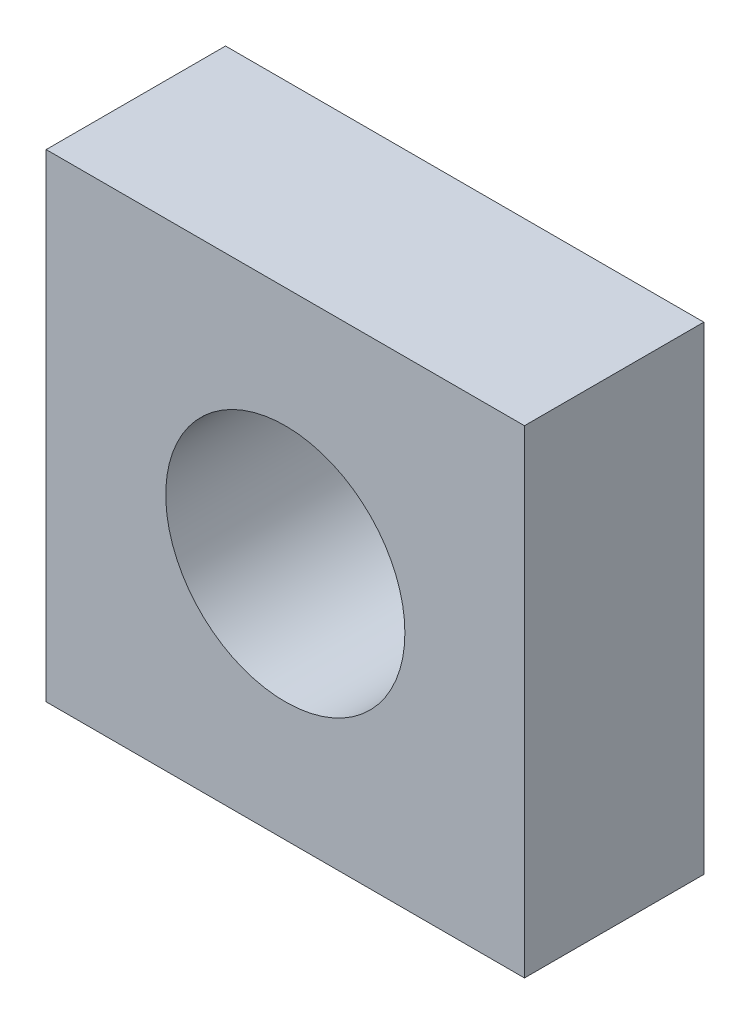
ISO-10303-21;
HEADER;
FILE_DESCRIPTION(('STEP AP214'),'2;1');
FILE_NAME('part.step','',(''),(''),'','','');
FILE_SCHEMA(('AUTOMOTIVE_DESIGN { 1 0 10303 214 1 1 1 1 }'));
ENDSEC;
DATA;
#1=APPLICATION_CONTEXT('core data for automotive mechanical design processes');
#2=APPLICATION_PROTOCOL_DEFINITION('international standard','automotive_design',2000,#1);
#3=PRODUCT_CONTEXT('',#1,'mechanical');
#4=PRODUCT('Part','Part','',(#3));
#5=PRODUCT_RELATED_PRODUCT_CATEGORY('part','',(#4));
#6=PRODUCT_DEFINITION_FORMATION('','',#4);
#7=PRODUCT_DEFINITION_CONTEXT('part definition',#1,'design');
#8=PRODUCT_DEFINITION('design','',#6,#7);
#9=PRODUCT_DEFINITION_SHAPE('','',#8);
#10=(LENGTH_UNIT() NAMED_UNIT(*) SI_UNIT(.MILLI.,.METRE.));
#11=(NAMED_UNIT(*) PLANE_ANGLE_UNIT() SI_UNIT($,.RADIAN.));
#12=(NAMED_UNIT(*) SI_UNIT($,.STERADIAN.) SOLID_ANGLE_UNIT());
#13=UNCERTAINTY_MEASURE_WITH_UNIT(LENGTH_MEASURE(1.E-05),#10,'distance_accuracy_value','');
#14=(GEOMETRIC_REPRESENTATION_CONTEXT(3) GLOBAL_UNCERTAINTY_ASSIGNED_CONTEXT((#13)) GLOBAL_UNIT_ASSIGNED_CONTEXT((#10,
#11,#12)) REPRESENTATION_CONTEXT('',''));
#15=CARTESIAN_POINT('',(0.,0.,0.));
#16=DIRECTION('',(0.,0.,1.));
#17=DIRECTION('',(1.,0.,0.));
#18=AXIS2_PLACEMENT_3D('',#15,#16,#17);
#19=CARTESIAN_POINT('',(0.,0.,30.));
#20=DIRECTION('',(0.,0.,-1.));
#21=DIRECTION('',(-1.,0.,0.));
#22=AXIS2_PLACEMENT_3D('',#19,#20,#21);
#23=PLANE('',#22);
#24=DIRECTION('',(-1.,0.,0.));
#25=VECTOR('',#24,1.);
#26=CARTESIAN_POINT('',(570.,580.,30.));
#27=LINE('',#26,#25);
#28=CARTESIAN_POINT('',(650.,580.,30.));
#29=VERTEX_POINT('',#28);
#30=CARTESIAN_POINT('',(570.,580.,30.));
#31=VERTEX_POINT('',#30);
#32=EDGE_CURVE('E85',#29,#31,#27,.T.);
#33=ORIENTED_EDGE('',*,*,#32,.T.);
#34=DIRECTION('',(0.,-1.,0.));
#35=VECTOR('',#34,1.);
#36=CARTESIAN_POINT('',(570.,580.,30.));
#37=LINE('',#36,#35);
#38=CARTESIAN_POINT('',(570.,500.,30.));
#39=VERTEX_POINT('',#38);
#40=EDGE_CURVE('E80',#31,#39,#37,.T.);
#41=ORIENTED_EDGE('',*,*,#40,.T.);
#42=DIRECTION('',(1.,0.,0.));
#43=VECTOR('',#42,1.);
#44=CARTESIAN_POINT('',(650.,500.,30.));
#45=LINE('',#44,#43);
#46=CARTESIAN_POINT('',(650.,500.,30.));
#47=VERTEX_POINT('',#46);
#48=EDGE_CURVE('E83',#39,#47,#45,.T.);
#49=ORIENTED_EDGE('',*,*,#48,.T.);
#50=DIRECTION('',(0.,1.,0.));
#51=VECTOR('',#50,1.);
#52=CARTESIAN_POINT('',(650.,580.,30.));
#53=LINE('',#52,#51);
#54=EDGE_CURVE('E50',#47,#29,#53,.T.);
#55=ORIENTED_EDGE('',*,*,#54,.T.);
#56=EDGE_LOOP('',(#33,#41,#49,#55));
#57=FACE_BOUND('',#56,.T.);
#58=CARTESIAN_POINT('',(610.,540.,30.));
#59=DIRECTION('',(0.,0.,1.));
#60=DIRECTION('',(1.,0.,0.));
#61=AXIS2_PLACEMENT_3D('',#58,#59,#60);
#62=CIRCLE('',#61,20.);
#63=CARTESIAN_POINT('',(630.,540.,30.));
#64=VERTEX_POINT('',#63);
#65=EDGE_CURVE('E100',#64,#64,#62,.T.);
#66=ORIENTED_EDGE('',*,*,#65,.F.);
#67=EDGE_LOOP('',(#66));
#68=FACE_BOUND('',#67,.T.);
#69=ADVANCED_FACE('F33',(#57,#68),#23,.F.);
#70=CARTESIAN_POINT('',(0.,0.,0.));
#71=DIRECTION('',(0.,0.,-1.));
#72=DIRECTION('',(-1.,0.,0.));
#73=AXIS2_PLACEMENT_3D('',#70,#71,#72);
#74=PLANE('',#73);
#75=DIRECTION('',(-1.,0.,0.));
#76=VECTOR('',#75,1.);
#77=CARTESIAN_POINT('',(570.,580.,0.));
#78=LINE('',#77,#76);
#79=CARTESIAN_POINT('',(650.,580.,0.));
#80=VERTEX_POINT('',#79);
#81=CARTESIAN_POINT('',(570.,580.,0.));
#82=VERTEX_POINT('',#81);
#83=EDGE_CURVE('E97',#80,#82,#78,.T.);
#84=ORIENTED_EDGE('',*,*,#83,.F.);
#85=DIRECTION('',(0.,1.,0.));
#86=VECTOR('',#85,1.);
#87=CARTESIAN_POINT('',(650.,580.,0.));
#88=LINE('',#87,#86);
#89=CARTESIAN_POINT('',(650.,500.,0.));
#90=VERTEX_POINT('',#89);
#91=EDGE_CURVE('E73',#90,#80,#88,.T.);
#92=ORIENTED_EDGE('',*,*,#91,.F.);
#93=DIRECTION('',(1.,0.,0.));
#94=VECTOR('',#93,1.);
#95=CARTESIAN_POINT('',(650.,500.,0.));
#96=LINE('',#95,#94);
#97=CARTESIAN_POINT('',(570.,500.,0.));
#98=VERTEX_POINT('',#97);
#99=EDGE_CURVE('E67',#98,#90,#96,.T.);
#100=ORIENTED_EDGE('',*,*,#99,.F.);
#101=DIRECTION('',(0.,-1.,0.));
#102=VECTOR('',#101,1.);
#103=CARTESIAN_POINT('',(570.,580.,0.));
#104=LINE('',#103,#102);
#105=EDGE_CURVE('E89',#82,#98,#104,.T.);
#106=ORIENTED_EDGE('',*,*,#105,.F.);
#107=EDGE_LOOP('',(#84,#92,#100,#106));
#108=FACE_BOUND('',#107,.T.);
#109=CARTESIAN_POINT('',(610.,540.,0.));
#110=DIRECTION('',(0.,0.,1.));
#111=DIRECTION('',(1.,0.,0.));
#112=AXIS2_PLACEMENT_3D('',#109,#110,#111);
#113=CIRCLE('',#112,20.);
#114=CARTESIAN_POINT('',(630.,540.,0.));
#115=VERTEX_POINT('',#114);
#116=EDGE_CURVE('E112',#115,#115,#113,.T.);
#117=ORIENTED_EDGE('',*,*,#116,.T.);
#118=EDGE_LOOP('',(#117));
#119=FACE_BOUND('',#118,.T.);
#120=ADVANCED_FACE('F108',(#108,#119),#74,.T.);
#121=CARTESIAN_POINT('',(570.,580.,30.));
#122=DIRECTION('',(0.,-1.,0.));
#123=DIRECTION('',(0.,0.,-1.));
#124=AXIS2_PLACEMENT_3D('',#121,#122,#123);
#125=PLANE('',#124);
#126=ORIENTED_EDGE('',*,*,#83,.T.);
#127=DIRECTION('',(0.,0.,-1.));
#128=VECTOR('',#127,1.);
#129=CARTESIAN_POINT('',(570.,580.,30.));
#130=LINE('',#129,#128);
#131=EDGE_CURVE('E11',#31,#82,#130,.T.);
#132=ORIENTED_EDGE('',*,*,#131,.F.);
#133=ORIENTED_EDGE('',*,*,#32,.F.);
#134=DIRECTION('',(0.,0.,-1.));
#135=VECTOR('',#134,1.);
#136=CARTESIAN_POINT('',(650.,580.,30.));
#137=LINE('',#136,#135);
#138=EDGE_CURVE('E93',#29,#80,#137,.T.);
#139=ORIENTED_EDGE('',*,*,#138,.T.);
#140=EDGE_LOOP('',(#126,#132,#133,#139));
#141=FACE_BOUND('',#140,.T.);
#142=ADVANCED_FACE('F35',(#141),#125,.F.);
#143=CARTESIAN_POINT('',(570.,580.,30.));
#144=DIRECTION('',(1.,0.,0.));
#145=DIRECTION('',(0.,0.,-1.));
#146=AXIS2_PLACEMENT_3D('',#143,#144,#145);
#147=PLANE('',#146);
#148=ORIENTED_EDGE('',*,*,#105,.T.);
#149=DIRECTION('',(0.,0.,-1.));
#150=VECTOR('',#149,1.);
#151=CARTESIAN_POINT('',(570.,500.,30.));
#152=LINE('',#151,#150);
#153=EDGE_CURVE('E42',#39,#98,#152,.T.);
#154=ORIENTED_EDGE('',*,*,#153,.F.);
#155=ORIENTED_EDGE('',*,*,#40,.F.);
#156=ORIENTED_EDGE('',*,*,#131,.T.);
#157=EDGE_LOOP('',(#148,#154,#155,#156));
#158=FACE_BOUND('',#157,.T.);
#159=ADVANCED_FACE('F88',(#158),#147,.F.);
#160=CARTESIAN_POINT('',(650.,500.,30.));
#161=DIRECTION('',(0.,1.,0.));
#162=DIRECTION('',(0.,0.,1.));
#163=AXIS2_PLACEMENT_3D('',#160,#161,#162);
#164=PLANE('',#163);
#165=ORIENTED_EDGE('',*,*,#99,.T.);
#166=DIRECTION('',(0.,0.,-1.));
#167=VECTOR('',#166,1.);
#168=CARTESIAN_POINT('',(650.,500.,30.));
#169=LINE('',#168,#167);
#170=EDGE_CURVE('E90',#47,#90,#169,.T.);
#171=ORIENTED_EDGE('',*,*,#170,.F.);
#172=ORIENTED_EDGE('',*,*,#48,.F.);
#173=ORIENTED_EDGE('',*,*,#153,.T.);
#174=EDGE_LOOP('',(#165,#171,#172,#173));
#175=FACE_BOUND('',#174,.T.);
#176=ADVANCED_FACE('F91',(#175),#164,.F.);
#177=CARTESIAN_POINT('',(650.,580.,30.));
#178=DIRECTION('',(-1.,0.,0.));
#179=DIRECTION('',(0.,-1.,0.));
#180=AXIS2_PLACEMENT_3D('',#177,#178,#179);
#181=PLANE('',#180);
#182=ORIENTED_EDGE('',*,*,#91,.T.);
#183=ORIENTED_EDGE('',*,*,#138,.F.);
#184=ORIENTED_EDGE('',*,*,#54,.F.);
#185=ORIENTED_EDGE('',*,*,#170,.T.);
#186=EDGE_LOOP('',(#182,#183,#184,#185));
#187=FACE_BOUND('',#186,.T.);
#188=ADVANCED_FACE('F105',(#187),#181,.F.);
#189=CARTESIAN_POINT('',(610.,540.,30.));
#190=DIRECTION('',(0.,0.,-1.));
#191=DIRECTION('',(-1.,0.,0.));
#192=AXIS2_PLACEMENT_3D('',#189,#190,#191);
#193=CYLINDRICAL_SURFACE('',#192,20.);
#194=ORIENTED_EDGE('',*,*,#65,.T.);
#195=EDGE_LOOP('',(#194));
#196=FACE_BOUND('',#195,.T.);
#197=ORIENTED_EDGE('',*,*,#116,.F.);
#198=EDGE_LOOP('',(#197));
#199=FACE_BOUND('',#198,.T.);
#200=ADVANCED_FACE('F118',(#196,#199),#193,.F.);
#201=CLOSED_SHELL('',(#69,#120,#142,#159,#176,#188,#200));
#202=MANIFOLD_SOLID_BREP('B2',#201);
#203=ADVANCED_BREP_SHAPE_REPRESENTATION('',(#18,#202),#14);
#204=SHAPE_DEFINITION_REPRESENTATION(#9,#203);
ENDSEC;
END-ISO-10303-21;
